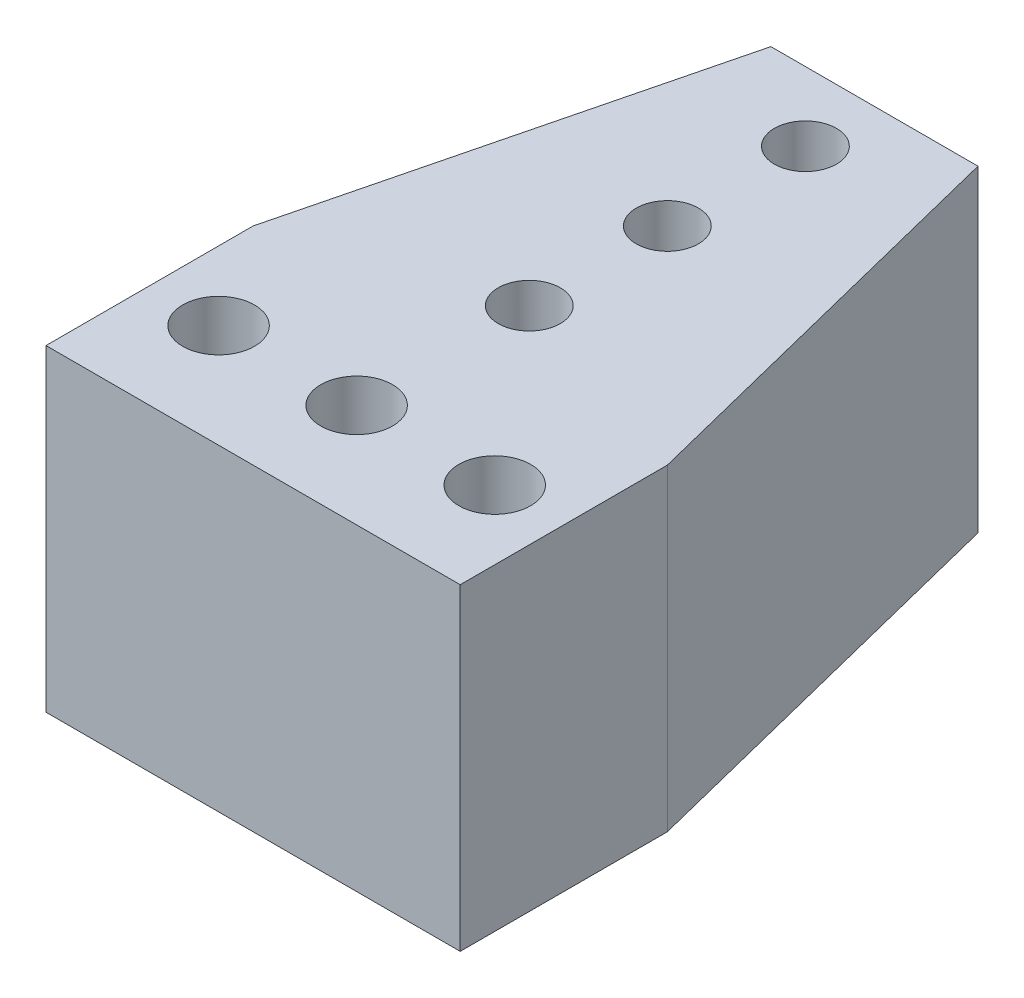
ISO-10303-21;
HEADER;
FILE_DESCRIPTION(('STEP AP214'),'2;1');
FILE_NAME('part.step','',(''),(''),'','','');
FILE_SCHEMA(('AUTOMOTIVE_DESIGN { 1 0 10303 214 1 1 1 1 }'));
ENDSEC;
DATA;
#1=APPLICATION_CONTEXT('core data for automotive mechanical design processes');
#2=APPLICATION_PROTOCOL_DEFINITION('international standard','automotive_design',2000,#1);
#3=PRODUCT_CONTEXT('',#1,'mechanical');
#4=PRODUCT('Part','Part','',(#3));
#5=PRODUCT_RELATED_PRODUCT_CATEGORY('part','',(#4));
#6=PRODUCT_DEFINITION_FORMATION('','',#4);
#7=PRODUCT_DEFINITION_CONTEXT('part definition',#1,'design');
#8=PRODUCT_DEFINITION('design','',#6,#7);
#9=PRODUCT_DEFINITION_SHAPE('','',#8);
#10=(LENGTH_UNIT() NAMED_UNIT(*) SI_UNIT(.MILLI.,.METRE.));
#11=(NAMED_UNIT(*) PLANE_ANGLE_UNIT() SI_UNIT($,.RADIAN.));
#12=(NAMED_UNIT(*) SI_UNIT($,.STERADIAN.) SOLID_ANGLE_UNIT());
#13=UNCERTAINTY_MEASURE_WITH_UNIT(LENGTH_MEASURE(1.E-05),#10,'distance_accuracy_value','');
#14=(GEOMETRIC_REPRESENTATION_CONTEXT(3) GLOBAL_UNCERTAINTY_ASSIGNED_CONTEXT((#13)) GLOBAL_UNIT_ASSIGNED_CONTEXT((#10,
#11,#12)) REPRESENTATION_CONTEXT('',''));
#15=CARTESIAN_POINT('',(0.,0.,0.));
#16=DIRECTION('',(0.,0.,1.));
#17=DIRECTION('',(1.,0.,0.));
#18=AXIS2_PLACEMENT_3D('',#15,#16,#17);
#19=CARTESIAN_POINT('',(0.,23.,0.));
#20=DIRECTION('',(0.,-1.,0.));
#21=DIRECTION('',(0.,0.,-1.));
#22=AXIS2_PLACEMENT_3D('',#19,#20,#21);
#23=PLANE('',#22);
#24=DIRECTION('',(-0.242535625036333,0.,0.970142500145332));
#25=VECTOR('',#24,1.);
#26=CARTESIAN_POINT('',(-7.5,23.,-37.5));
#27=LINE('',#26,#25);
#28=CARTESIAN_POINT('',(-7.5,23.,-37.5));
#29=VERTEX_POINT('',#28);
#30=CARTESIAN_POINT('',(-15.,23.,-7.5));
#31=VERTEX_POINT('',#30);
#32=EDGE_CURVE('E121',#29,#31,#27,.T.);
#33=ORIENTED_EDGE('',*,*,#32,.T.);
#34=DIRECTION('',(0.,0.,1.));
#35=VECTOR('',#34,1.);
#36=CARTESIAN_POINT('',(-15.,23.,7.5));
#37=LINE('',#36,#35);
#38=CARTESIAN_POINT('',(-15.,23.,7.5));
#39=VERTEX_POINT('',#38);
#40=EDGE_CURVE('E158',#31,#39,#37,.T.);
#41=ORIENTED_EDGE('',*,*,#40,.T.);
#42=DIRECTION('',(1.,0.,0.));
#43=VECTOR('',#42,1.);
#44=CARTESIAN_POINT('',(-15.,23.,7.5));
#45=LINE('',#44,#43);
#46=CARTESIAN_POINT('',(15.,23.,7.5));
#47=VERTEX_POINT('',#46);
#48=EDGE_CURVE('E52',#39,#47,#45,.T.);
#49=ORIENTED_EDGE('',*,*,#48,.T.);
#50=DIRECTION('',(0.,0.,-1.));
#51=VECTOR('',#50,1.);
#52=CARTESIAN_POINT('',(15.,23.,7.5));
#53=LINE('',#52,#51);
#54=CARTESIAN_POINT('',(15.,23.,-7.5));
#55=VERTEX_POINT('',#54);
#56=EDGE_CURVE('E76',#47,#55,#53,.T.);
#57=ORIENTED_EDGE('',*,*,#56,.T.);
#58=DIRECTION('',(-0.242535625036333,0.,-0.970142500145332));
#59=VECTOR('',#58,1.);
#60=CARTESIAN_POINT('',(15.,23.,-7.5));
#61=LINE('',#60,#59);
#62=CARTESIAN_POINT('',(7.5,23.,-37.5));
#63=VERTEX_POINT('',#62);
#64=EDGE_CURVE('E114',#55,#63,#61,.T.);
#65=ORIENTED_EDGE('',*,*,#64,.T.);
#66=DIRECTION('',(-1.,0.,0.));
#67=VECTOR('',#66,1.);
#68=CARTESIAN_POINT('',(7.5,23.,-37.5));
#69=LINE('',#68,#67);
#70=EDGE_CURVE('E99',#63,#29,#69,.T.);
#71=ORIENTED_EDGE('',*,*,#70,.T.);
#72=EDGE_LOOP('',(#33,#41,#49,#57,#65,#71));
#73=FACE_BOUND('',#72,.T.);
#74=CARTESIAN_POINT('',(0.,23.,-12.5));
#75=DIRECTION('',(0.,1.,0.));
#76=DIRECTION('',(0.,0.,1.));
#77=AXIS2_PLACEMENT_3D('',#74,#75,#76);
#78=CIRCLE('',#77,2.25);
#79=CARTESIAN_POINT('',(0.,23.,-10.25));
#80=VERTEX_POINT('',#79);
#81=EDGE_CURVE('E127',#80,#80,#78,.T.);
#82=ORIENTED_EDGE('',*,*,#81,.F.);
#83=EDGE_LOOP('',(#82));
#84=FACE_BOUND('',#83,.T.);
#85=CARTESIAN_POINT('',(0.,23.,-22.5));
#86=DIRECTION('',(0.,1.,0.));
#87=DIRECTION('',(0.,0.,1.));
#88=AXIS2_PLACEMENT_3D('',#85,#86,#87);
#89=CIRCLE('',#88,2.25);
#90=CARTESIAN_POINT('',(0.,23.,-20.25));
#91=VERTEX_POINT('',#90);
#92=EDGE_CURVE('E130',#91,#91,#89,.T.);
#93=ORIENTED_EDGE('',*,*,#92,.F.);
#94=EDGE_LOOP('',(#93));
#95=FACE_BOUND('',#94,.T.);
#96=CARTESIAN_POINT('',(0.,23.,-32.5));
#97=DIRECTION('',(0.,1.,0.));
#98=DIRECTION('',(0.,0.,1.));
#99=AXIS2_PLACEMENT_3D('',#96,#97,#98);
#100=CIRCLE('',#99,2.25);
#101=CARTESIAN_POINT('',(0.,23.,-30.25));
#102=VERTEX_POINT('',#101);
#103=EDGE_CURVE('E134',#102,#102,#100,.T.);
#104=ORIENTED_EDGE('',*,*,#103,.F.);
#105=EDGE_LOOP('',(#104));
#106=FACE_BOUND('',#105,.T.);
#107=CARTESIAN_POINT('',(10.,23.,0.));
#108=DIRECTION('',(0.,1.,0.));
#109=DIRECTION('',(0.,0.,1.));
#110=AXIS2_PLACEMENT_3D('',#107,#108,#109);
#111=CIRCLE('',#110,2.6);
#112=CARTESIAN_POINT('',(10.,23.,2.6));
#113=VERTEX_POINT('',#112);
#114=EDGE_CURVE('E145',#113,#113,#111,.T.);
#115=ORIENTED_EDGE('',*,*,#114,.F.);
#116=EDGE_LOOP('',(#115));
#117=FACE_BOUND('',#116,.T.);
#118=CARTESIAN_POINT('',(0.,23.,0.));
#119=DIRECTION('',(0.,1.,0.));
#120=DIRECTION('',(0.,0.,1.));
#121=AXIS2_PLACEMENT_3D('',#118,#119,#120);
#122=CIRCLE('',#121,2.6);
#123=CARTESIAN_POINT('',(0.,23.,2.6));
#124=VERTEX_POINT('',#123);
#125=EDGE_CURVE('E151',#124,#124,#122,.T.);
#126=ORIENTED_EDGE('',*,*,#125,.F.);
#127=EDGE_LOOP('',(#126));
#128=FACE_BOUND('',#127,.T.);
#129=CARTESIAN_POINT('',(-10.,23.,0.));
#130=DIRECTION('',(0.,1.,0.));
#131=DIRECTION('',(0.,0.,1.));
#132=AXIS2_PLACEMENT_3D('',#129,#130,#131);
#133=CIRCLE('',#132,2.6);
#134=CARTESIAN_POINT('',(-10.,23.,2.6));
#135=VERTEX_POINT('',#134);
#136=EDGE_CURVE('E139',#135,#135,#133,.T.);
#137=ORIENTED_EDGE('',*,*,#136,.F.);
#138=EDGE_LOOP('',(#137));
#139=FACE_BOUND('',#138,.T.);
#140=ADVANCED_FACE('F33',(#73,#84,#95,#106,#117,#128,#139),#23,.F.);
#141=CARTESIAN_POINT('',(0.,0.,0.));
#142=DIRECTION('',(0.,-1.,0.));
#143=DIRECTION('',(0.,0.,-1.));
#144=AXIS2_PLACEMENT_3D('',#141,#142,#143);
#145=PLANE('',#144);
#146=DIRECTION('',(0.,0.,1.));
#147=VECTOR('',#146,1.);
#148=CARTESIAN_POINT('',(-15.,0.,7.5));
#149=LINE('',#148,#147);
#150=CARTESIAN_POINT('',(-15.,0.,-7.5));
#151=VERTEX_POINT('',#150);
#152=CARTESIAN_POINT('',(-15.,0.,7.5));
#153=VERTEX_POINT('',#152);
#154=EDGE_CURVE('E67',#151,#153,#149,.T.);
#155=ORIENTED_EDGE('',*,*,#154,.F.);
#156=DIRECTION('',(-0.242535625036333,0.,0.970142500145332));
#157=VECTOR('',#156,1.);
#158=CARTESIAN_POINT('',(-7.5,0.,-37.5));
#159=LINE('',#158,#157);
#160=CARTESIAN_POINT('',(-7.5,0.,-37.5));
#161=VERTEX_POINT('',#160);
#162=EDGE_CURVE('E125',#161,#151,#159,.T.);
#163=ORIENTED_EDGE('',*,*,#162,.F.);
#164=DIRECTION('',(-1.,0.,0.));
#165=VECTOR('',#164,1.);
#166=CARTESIAN_POINT('',(7.5,0.,-37.5));
#167=LINE('',#166,#165);
#168=CARTESIAN_POINT('',(7.5,0.,-37.5));
#169=VERTEX_POINT('',#168);
#170=EDGE_CURVE('E108',#169,#161,#167,.T.);
#171=ORIENTED_EDGE('',*,*,#170,.F.);
#172=DIRECTION('',(-0.242535625036333,0.,-0.970142500145332));
#173=VECTOR('',#172,1.);
#174=CARTESIAN_POINT('',(15.,0.,-7.5));
#175=LINE('',#174,#173);
#176=CARTESIAN_POINT('',(15.,0.,-7.5));
#177=VERTEX_POINT('',#176);
#178=EDGE_CURVE('E116',#177,#169,#175,.T.);
#179=ORIENTED_EDGE('',*,*,#178,.F.);
#180=DIRECTION('',(0.,0.,-1.));
#181=VECTOR('',#180,1.);
#182=CARTESIAN_POINT('',(15.,0.,7.5));
#183=LINE('',#182,#181);
#184=CARTESIAN_POINT('',(15.,0.,7.5));
#185=VERTEX_POINT('',#184);
#186=EDGE_CURVE('E154',#185,#177,#183,.T.);
#187=ORIENTED_EDGE('',*,*,#186,.F.);
#188=DIRECTION('',(1.,0.,0.));
#189=VECTOR('',#188,1.);
#190=CARTESIAN_POINT('',(-15.,0.,7.5));
#191=LINE('',#190,#189);
#192=EDGE_CURVE('E72',#153,#185,#191,.T.);
#193=ORIENTED_EDGE('',*,*,#192,.F.);
#194=EDGE_LOOP('',(#155,#163,#171,#179,#187,#193));
#195=FACE_BOUND('',#194,.T.);
#196=CARTESIAN_POINT('',(0.,0.,-12.5));
#197=DIRECTION('',(0.,-1.,0.));
#198=DIRECTION('',(0.,0.,-1.));
#199=AXIS2_PLACEMENT_3D('',#196,#197,#198);
#200=CIRCLE('',#199,2.25);
#201=CARTESIAN_POINT('',(0.,0.,-14.75));
#202=VERTEX_POINT('',#201);
#203=EDGE_CURVE('E37',#202,#202,#200,.T.);
#204=ORIENTED_EDGE('',*,*,#203,.F.);
#205=EDGE_LOOP('',(#204));
#206=FACE_BOUND('',#205,.T.);
#207=CARTESIAN_POINT('',(0.,0.,-22.5));
#208=DIRECTION('',(0.,-1.,0.));
#209=DIRECTION('',(0.,0.,-1.));
#210=AXIS2_PLACEMENT_3D('',#207,#208,#209);
#211=CIRCLE('',#210,2.25);
#212=CARTESIAN_POINT('',(0.,0.,-24.75));
#213=VERTEX_POINT('',#212);
#214=EDGE_CURVE('E133',#213,#213,#211,.T.);
#215=ORIENTED_EDGE('',*,*,#214,.F.);
#216=EDGE_LOOP('',(#215));
#217=FACE_BOUND('',#216,.T.);
#218=CARTESIAN_POINT('',(0.,0.,-32.5));
#219=DIRECTION('',(0.,-1.,0.));
#220=DIRECTION('',(0.,0.,-1.));
#221=AXIS2_PLACEMENT_3D('',#218,#219,#220);
#222=CIRCLE('',#221,2.25);
#223=CARTESIAN_POINT('',(0.,0.,-34.75));
#224=VERTEX_POINT('',#223);
#225=EDGE_CURVE('E109',#224,#224,#222,.T.);
#226=ORIENTED_EDGE('',*,*,#225,.F.);
#227=EDGE_LOOP('',(#226));
#228=FACE_BOUND('',#227,.T.);
#229=CARTESIAN_POINT('',(10.,0.,0.));
#230=DIRECTION('',(0.,1.,0.));
#231=DIRECTION('',(0.,0.,1.));
#232=AXIS2_PLACEMENT_3D('',#229,#230,#231);
#233=CIRCLE('',#232,2.6);
#234=CARTESIAN_POINT('',(10.,0.,2.6));
#235=VERTEX_POINT('',#234);
#236=EDGE_CURVE('E142',#235,#235,#233,.T.);
#237=ORIENTED_EDGE('',*,*,#236,.T.);
#238=EDGE_LOOP('',(#237));
#239=FACE_BOUND('',#238,.T.);
#240=CARTESIAN_POINT('',(0.,0.,0.));
#241=DIRECTION('',(0.,1.,0.));
#242=DIRECTION('',(0.,0.,1.));
#243=AXIS2_PLACEMENT_3D('',#240,#241,#242);
#244=CIRCLE('',#243,2.6);
#245=CARTESIAN_POINT('',(0.,0.,2.6));
#246=VERTEX_POINT('',#245);
#247=EDGE_CURVE('E148',#246,#246,#244,.T.);
#248=ORIENTED_EDGE('',*,*,#247,.T.);
#249=EDGE_LOOP('',(#248));
#250=FACE_BOUND('',#249,.T.);
#251=CARTESIAN_POINT('',(-10.,0.,0.));
#252=DIRECTION('',(0.,1.,0.));
#253=DIRECTION('',(0.,0.,1.));
#254=AXIS2_PLACEMENT_3D('',#251,#252,#253);
#255=CIRCLE('',#254,2.6);
#256=CARTESIAN_POINT('',(-10.,0.,2.6));
#257=VERTEX_POINT('',#256);
#258=EDGE_CURVE('E117',#257,#257,#255,.T.);
#259=ORIENTED_EDGE('',*,*,#258,.T.);
#260=EDGE_LOOP('',(#259));
#261=FACE_BOUND('',#260,.T.);
#262=ADVANCED_FACE('F176',(#195,#206,#217,#228,#239,#250,#261),#145,.T.);
#263=CARTESIAN_POINT('',(15.,23.,7.5));
#264=DIRECTION('',(-1.,0.,0.));
#265=DIRECTION('',(0.,0.,1.));
#266=AXIS2_PLACEMENT_3D('',#263,#264,#265);
#267=PLANE('',#266);
#268=ORIENTED_EDGE('',*,*,#186,.T.);
#269=DIRECTION('',(0.,-1.,0.));
#270=VECTOR('',#269,1.);
#271=CARTESIAN_POINT('',(15.,23.,-7.5));
#272=LINE('',#271,#270);
#273=EDGE_CURVE('E11',#55,#177,#272,.T.);
#274=ORIENTED_EDGE('',*,*,#273,.F.);
#275=ORIENTED_EDGE('',*,*,#56,.F.);
#276=DIRECTION('',(0.,-1.,0.));
#277=VECTOR('',#276,1.);
#278=CARTESIAN_POINT('',(15.,23.,7.5));
#279=LINE('',#278,#277);
#280=EDGE_CURVE('E161',#47,#185,#279,.T.);
#281=ORIENTED_EDGE('',*,*,#280,.T.);
#282=EDGE_LOOP('',(#268,#274,#275,#281));
#283=FACE_BOUND('',#282,.T.);
#284=ADVANCED_FACE('F35',(#283),#267,.F.);
#285=CARTESIAN_POINT('',(-15.,23.,7.5));
#286=DIRECTION('',(1.,0.,0.));
#287=DIRECTION('',(0.,0.,-1.));
#288=AXIS2_PLACEMENT_3D('',#285,#286,#287);
#289=PLANE('',#288);
#290=ORIENTED_EDGE('',*,*,#154,.T.);
#291=DIRECTION('',(0.,-1.,0.));
#292=VECTOR('',#291,1.);
#293=CARTESIAN_POINT('',(-15.,23.,7.5));
#294=LINE('',#293,#292);
#295=EDGE_CURVE('E166',#39,#153,#294,.T.);
#296=ORIENTED_EDGE('',*,*,#295,.F.);
#297=ORIENTED_EDGE('',*,*,#40,.F.);
#298=DIRECTION('',(0.,-1.,0.));
#299=VECTOR('',#298,1.);
#300=CARTESIAN_POINT('',(-15.,23.,-7.5));
#301=LINE('',#300,#299);
#302=EDGE_CURVE('E43',#31,#151,#301,.T.);
#303=ORIENTED_EDGE('',*,*,#302,.T.);
#304=EDGE_LOOP('',(#290,#296,#297,#303));
#305=FACE_BOUND('',#304,.T.);
#306=ADVANCED_FACE('F211',(#305),#289,.F.);
#307=CARTESIAN_POINT('',(-15.,23.,7.5));
#308=DIRECTION('',(0.,0.,-1.));
#309=DIRECTION('',(-1.,0.,0.));
#310=AXIS2_PLACEMENT_3D('',#307,#308,#309);
#311=PLANE('',#310);
#312=ORIENTED_EDGE('',*,*,#192,.T.);
#313=ORIENTED_EDGE('',*,*,#280,.F.);
#314=ORIENTED_EDGE('',*,*,#48,.F.);
#315=ORIENTED_EDGE('',*,*,#295,.T.);
#316=EDGE_LOOP('',(#312,#313,#314,#315));
#317=FACE_BOUND('',#316,.T.);
#318=ADVANCED_FACE('F209',(#317),#311,.F.);
#319=CARTESIAN_POINT('',(0.,23.,0.));
#320=DIRECTION('',(0.,-1.,0.));
#321=DIRECTION('',(0.,0.,-1.));
#322=AXIS2_PLACEMENT_3D('',#319,#320,#321);
#323=CYLINDRICAL_SURFACE('',#322,2.6);
#324=ORIENTED_EDGE('',*,*,#125,.T.);
#325=EDGE_LOOP('',(#324));
#326=FACE_BOUND('',#325,.T.);
#327=ORIENTED_EDGE('',*,*,#247,.F.);
#328=EDGE_LOOP('',(#327));
#329=FACE_BOUND('',#328,.T.);
#330=ADVANCED_FACE('F200',(#326,#329),#323,.F.);
#331=CARTESIAN_POINT('',(10.,23.,0.));
#332=DIRECTION('',(0.,-1.,0.));
#333=DIRECTION('',(0.,0.,-1.));
#334=AXIS2_PLACEMENT_3D('',#331,#332,#333);
#335=CYLINDRICAL_SURFACE('',#334,2.6);
#336=ORIENTED_EDGE('',*,*,#114,.T.);
#337=EDGE_LOOP('',(#336));
#338=FACE_BOUND('',#337,.T.);
#339=ORIENTED_EDGE('',*,*,#236,.F.);
#340=EDGE_LOOP('',(#339));
#341=FACE_BOUND('',#340,.T.);
#342=ADVANCED_FACE('F191',(#338,#341),#335,.F.);
#343=CARTESIAN_POINT('',(-10.,23.,0.));
#344=DIRECTION('',(0.,-1.,0.));
#345=DIRECTION('',(0.,0.,-1.));
#346=AXIS2_PLACEMENT_3D('',#343,#344,#345);
#347=CYLINDRICAL_SURFACE('',#346,2.6);
#348=ORIENTED_EDGE('',*,*,#136,.T.);
#349=EDGE_LOOP('',(#348));
#350=FACE_BOUND('',#349,.T.);
#351=ORIENTED_EDGE('',*,*,#258,.F.);
#352=EDGE_LOOP('',(#351));
#353=FACE_BOUND('',#352,.T.);
#354=ADVANCED_FACE('F189',(#350,#353),#347,.F.);
#355=CARTESIAN_POINT('',(7.5,-33.5410196624969,-37.5));
#356=DIRECTION('',(0.,0.,-1.));
#357=DIRECTION('',(-1.,0.,0.));
#358=AXIS2_PLACEMENT_3D('',#355,#356,#357);
#359=PLANE('',#358);
#360=DIRECTION('',(0.,1.,0.));
#361=VECTOR('',#360,1.);
#362=CARTESIAN_POINT('',(7.5,-33.5410196624969,-37.5));
#363=LINE('',#362,#361);
#364=EDGE_CURVE('E103',#169,#63,#363,.T.);
#365=ORIENTED_EDGE('',*,*,#364,.F.);
#366=ORIENTED_EDGE('',*,*,#170,.T.);
#367=DIRECTION('',(0.,1.,0.));
#368=VECTOR('',#367,1.);
#369=CARTESIAN_POINT('',(-7.5,-33.5410196624969,-37.5));
#370=LINE('',#369,#368);
#371=EDGE_CURVE('E106',#161,#29,#370,.T.);
#372=ORIENTED_EDGE('',*,*,#371,.T.);
#373=ORIENTED_EDGE('',*,*,#70,.F.);
#374=EDGE_LOOP('',(#365,#366,#372,#373));
#375=FACE_BOUND('',#374,.T.);
#376=ADVANCED_FACE('F101',(#375),#359,.T.);
#377=CARTESIAN_POINT('',(0.,-5.00000000014378E-05,-32.5));
#378=DIRECTION('',(0.,1.,0.));
#379=DIRECTION('',(0.,0.,1.));
#380=AXIS2_PLACEMENT_3D('',#377,#378,#379);
#381=CYLINDRICAL_SURFACE('',#380,2.25);
#382=ORIENTED_EDGE('',*,*,#225,.T.);
#383=EDGE_LOOP('',(#382));
#384=FACE_BOUND('',#383,.T.);
#385=ORIENTED_EDGE('',*,*,#103,.T.);
#386=EDGE_LOOP('',(#385));
#387=FACE_BOUND('',#386,.T.);
#388=ADVANCED_FACE('F198',(#384,#387),#381,.F.);
#389=CARTESIAN_POINT('',(0.,-5.00000000014378E-05,-22.5));
#390=DIRECTION('',(0.,1.,0.));
#391=DIRECTION('',(0.,0.,1.));
#392=AXIS2_PLACEMENT_3D('',#389,#390,#391);
#393=CYLINDRICAL_SURFACE('',#392,2.25);
#394=ORIENTED_EDGE('',*,*,#214,.T.);
#395=EDGE_LOOP('',(#394));
#396=FACE_BOUND('',#395,.T.);
#397=ORIENTED_EDGE('',*,*,#92,.T.);
#398=EDGE_LOOP('',(#397));
#399=FACE_BOUND('',#398,.T.);
#400=ADVANCED_FACE('F173',(#396,#399),#393,.F.);
#401=CARTESIAN_POINT('',(0.,-5.00000000014378E-05,-12.5));
#402=DIRECTION('',(0.,1.,0.));
#403=DIRECTION('',(0.,0.,1.));
#404=AXIS2_PLACEMENT_3D('',#401,#402,#403);
#405=CYLINDRICAL_SURFACE('',#404,2.25);
#406=ORIENTED_EDGE('',*,*,#203,.T.);
#407=EDGE_LOOP('',(#406));
#408=FACE_BOUND('',#407,.T.);
#409=ORIENTED_EDGE('',*,*,#81,.T.);
#410=EDGE_LOOP('',(#409));
#411=FACE_BOUND('',#410,.T.);
#412=ADVANCED_FACE('F225',(#408,#411),#405,.F.);
#413=CARTESIAN_POINT('',(-7.5,-30.9232921921325,-37.5));
#414=DIRECTION('',(-0.970142500145332,0.,-0.242535625036333));
#415=DIRECTION('',(-0.242535625036333,0.,0.970142500145332));
#416=AXIS2_PLACEMENT_3D('',#413,#414,#415);
#417=PLANE('',#416);
#418=ORIENTED_EDGE('',*,*,#371,.F.);
#419=ORIENTED_EDGE('',*,*,#162,.T.);
#420=ORIENTED_EDGE('',*,*,#302,.F.);
#421=ORIENTED_EDGE('',*,*,#32,.F.);
#422=EDGE_LOOP('',(#418,#419,#420,#421));
#423=FACE_BOUND('',#422,.T.);
#424=ADVANCED_FACE('F222',(#423),#417,.T.);
#425=CARTESIAN_POINT('',(15.,-30.9232921921325,-7.5));
#426=DIRECTION('',(0.970142500145332,0.,-0.242535625036333));
#427=DIRECTION('',(-0.242535625036333,0.,-0.970142500145332));
#428=AXIS2_PLACEMENT_3D('',#425,#426,#427);
#429=PLANE('',#428);
#430=ORIENTED_EDGE('',*,*,#273,.T.);
#431=ORIENTED_EDGE('',*,*,#178,.T.);
#432=ORIENTED_EDGE('',*,*,#364,.T.);
#433=ORIENTED_EDGE('',*,*,#64,.F.);
#434=EDGE_LOOP('',(#430,#431,#432,#433));
#435=FACE_BOUND('',#434,.T.);
#436=ADVANCED_FACE('F113',(#435),#429,.T.);
#437=CLOSED_SHELL('',(#140,#262,#284,#306,#318,#330,#342,#354,#376,#388,#400,#412,#424,#436));
#438=MANIFOLD_SOLID_BREP('B2',#437);
#439=ADVANCED_BREP_SHAPE_REPRESENTATION('',(#18,#438),#14);
#440=SHAPE_DEFINITION_REPRESENTATION(#9,#439);
ENDSEC;
END-ISO-10303-21;
